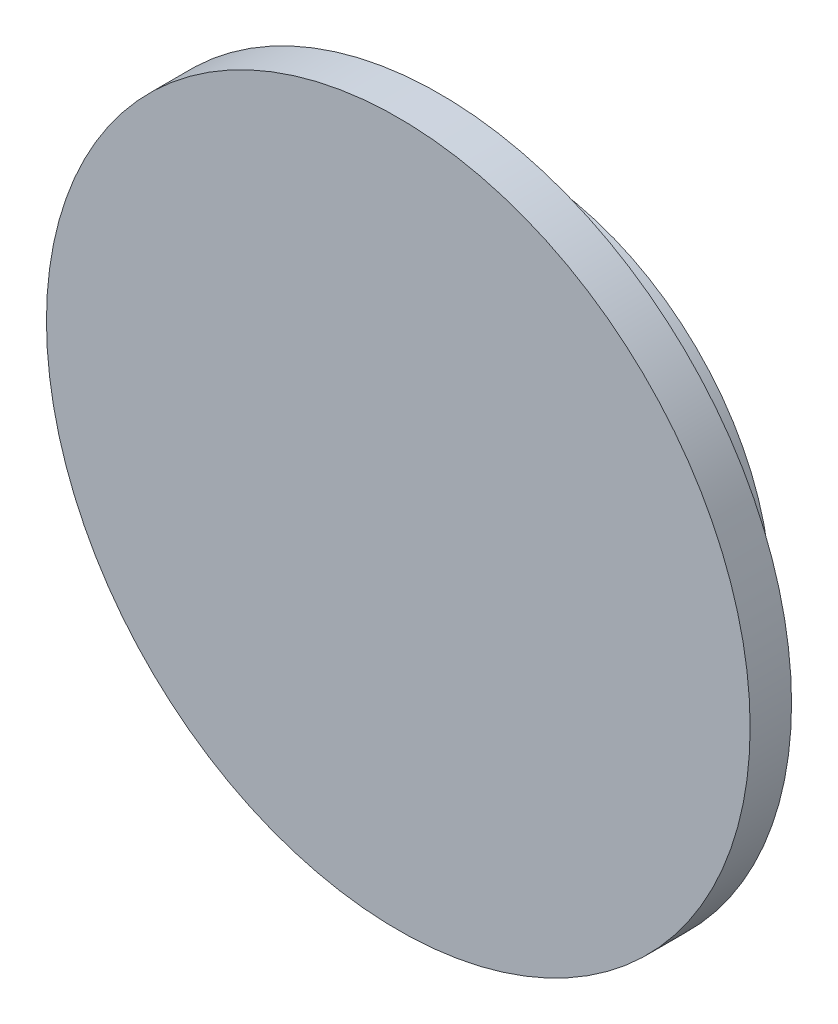
ISO-10303-21;
HEADER;
FILE_DESCRIPTION(('STEP AP214'),'2;1');
FILE_NAME('part.step','',(''),(''),'','','');
FILE_SCHEMA(('AUTOMOTIVE_DESIGN { 1 0 10303 214 1 1 1 1 }'));
ENDSEC;
DATA;
#1=APPLICATION_CONTEXT('core data for automotive mechanical design processes');
#2=APPLICATION_PROTOCOL_DEFINITION('international standard','automotive_design',2000,#1);
#3=PRODUCT_CONTEXT('',#1,'mechanical');
#4=PRODUCT('Part','Part','',(#3));
#5=PRODUCT_RELATED_PRODUCT_CATEGORY('part','',(#4));
#6=PRODUCT_DEFINITION_FORMATION('','',#4);
#7=PRODUCT_DEFINITION_CONTEXT('part definition',#1,'design');
#8=PRODUCT_DEFINITION('design','',#6,#7);
#9=PRODUCT_DEFINITION_SHAPE('','',#8);
#10=(LENGTH_UNIT() NAMED_UNIT(*) SI_UNIT(.MILLI.,.METRE.));
#11=(NAMED_UNIT(*) PLANE_ANGLE_UNIT() SI_UNIT($,.RADIAN.));
#12=(NAMED_UNIT(*) SI_UNIT($,.STERADIAN.) SOLID_ANGLE_UNIT());
#13=UNCERTAINTY_MEASURE_WITH_UNIT(LENGTH_MEASURE(1.E-05),#10,'distance_accuracy_value','');
#14=(GEOMETRIC_REPRESENTATION_CONTEXT(3) GLOBAL_UNCERTAINTY_ASSIGNED_CONTEXT((#13)) GLOBAL_UNIT_ASSIGNED_CONTEXT((#10,
#11,#12)) REPRESENTATION_CONTEXT('',''));
#15=CARTESIAN_POINT('',(0.,0.,0.));
#16=DIRECTION('',(0.,0.,1.));
#17=DIRECTION('',(1.,0.,0.));
#18=AXIS2_PLACEMENT_3D('',#15,#16,#17);
#19=CARTESIAN_POINT('',(-200.,-240.,-10.));
#20=DIRECTION('',(0.,0.,1.));
#21=DIRECTION('',(1.,0.,0.));
#22=AXIS2_PLACEMENT_3D('',#19,#20,#21);
#23=CYLINDRICAL_SURFACE('',#22,30.);
#24=CARTESIAN_POINT('',(-200.,-240.,-10.));
#25=DIRECTION('',(0.,0.,1.));
#26=DIRECTION('',(1.,0.,0.));
#27=AXIS2_PLACEMENT_3D('',#24,#25,#26);
#28=CIRCLE('',#27,30.);
#29=CARTESIAN_POINT('',(-170.,-240.,-10.));
#30=VERTEX_POINT('',#29);
#31=EDGE_CURVE('E10',#30,#30,#28,.T.);
#32=ORIENTED_EDGE('',*,*,#31,.T.);
#33=EDGE_LOOP('',(#32));
#34=FACE_BOUND('',#33,.T.);
#35=CARTESIAN_POINT('',(-200.,-240.,0.));
#36=DIRECTION('',(0.,0.,1.));
#37=DIRECTION('',(1.,0.,0.));
#38=AXIS2_PLACEMENT_3D('',#35,#36,#37);
#39=CIRCLE('',#38,30.);
#40=CARTESIAN_POINT('',(-170.,-240.,0.));
#41=VERTEX_POINT('',#40);
#42=EDGE_CURVE('E36',#41,#41,#39,.T.);
#43=ORIENTED_EDGE('',*,*,#42,.F.);
#44=EDGE_LOOP('',(#43));
#45=FACE_BOUND('',#44,.T.);
#46=ADVANCED_FACE('F33',(#34,#45),#23,.T.);
#47=CARTESIAN_POINT('',(-200.,-240.,-10.));
#48=DIRECTION('',(0.,0.,1.));
#49=DIRECTION('',(1.,0.,0.));
#50=AXIS2_PLACEMENT_3D('',#47,#48,#49);
#51=PLANE('',#50);
#52=ORIENTED_EDGE('',*,*,#31,.F.);
#53=EDGE_LOOP('',(#52));
#54=FACE_BOUND('',#53,.T.);
#55=ADVANCED_FACE('F56',(#54),#51,.F.);
#56=CARTESIAN_POINT('',(-200.,-240.,5.));
#57=DIRECTION('',(0.,0.,-1.));
#58=DIRECTION('',(-1.,0.,0.));
#59=AXIS2_PLACEMENT_3D('',#56,#57,#58);
#60=CYLINDRICAL_SURFACE('',#59,42.5);
#61=CARTESIAN_POINT('',(-200.,-240.,5.));
#62=DIRECTION('',(0.,0.,1.));
#63=DIRECTION('',(1.,0.,0.));
#64=AXIS2_PLACEMENT_3D('',#61,#62,#63);
#65=CIRCLE('',#64,42.5);
#66=CARTESIAN_POINT('',(-157.5,-240.,5.));
#67=VERTEX_POINT('',#66);
#68=EDGE_CURVE('E43',#67,#67,#65,.T.);
#69=ORIENTED_EDGE('',*,*,#68,.F.);
#70=EDGE_LOOP('',(#69));
#71=FACE_BOUND('',#70,.T.);
#72=CARTESIAN_POINT('',(-200.,-240.,0.));
#73=DIRECTION('',(0.,0.,1.));
#74=DIRECTION('',(1.,0.,0.));
#75=AXIS2_PLACEMENT_3D('',#72,#73,#74);
#76=CIRCLE('',#75,42.5);
#77=CARTESIAN_POINT('',(-157.5,-240.,0.));
#78=VERTEX_POINT('',#77);
#79=EDGE_CURVE('E45',#78,#78,#76,.T.);
#80=ORIENTED_EDGE('',*,*,#79,.T.);
#81=EDGE_LOOP('',(#80));
#82=FACE_BOUND('',#81,.T.);
#83=ADVANCED_FACE('F53',(#71,#82),#60,.T.);
#84=CARTESIAN_POINT('',(-200.,-240.,5.));
#85=DIRECTION('',(0.,0.,1.));
#86=DIRECTION('',(1.,0.,0.));
#87=AXIS2_PLACEMENT_3D('',#84,#85,#86);
#88=PLANE('',#87);
#89=ORIENTED_EDGE('',*,*,#68,.T.);
#90=EDGE_LOOP('',(#89));
#91=FACE_BOUND('',#90,.T.);
#92=ADVANCED_FACE('F51',(#91),#88,.T.);
#93=CARTESIAN_POINT('',(-200.,-240.,0.));
#94=DIRECTION('',(0.,0.,1.));
#95=DIRECTION('',(1.,0.,0.));
#96=AXIS2_PLACEMENT_3D('',#93,#94,#95);
#97=PLANE('',#96);
#98=ORIENTED_EDGE('',*,*,#42,.T.);
#99=EDGE_LOOP('',(#98));
#100=FACE_BOUND('',#99,.T.);
#101=ORIENTED_EDGE('',*,*,#79,.F.);
#102=EDGE_LOOP('',(#101));
#103=FACE_BOUND('',#102,.T.);
#104=ADVANCED_FACE('F60',(#100,#103),#97,.F.);
#105=CLOSED_SHELL('',(#46,#55,#83,#92,#104));
#106=MANIFOLD_SOLID_BREP('B2',#105);
#107=ADVANCED_BREP_SHAPE_REPRESENTATION('',(#18,#106),#14);
#108=SHAPE_DEFINITION_REPRESENTATION(#9,#107);
ENDSEC;
END-ISO-10303-21;
